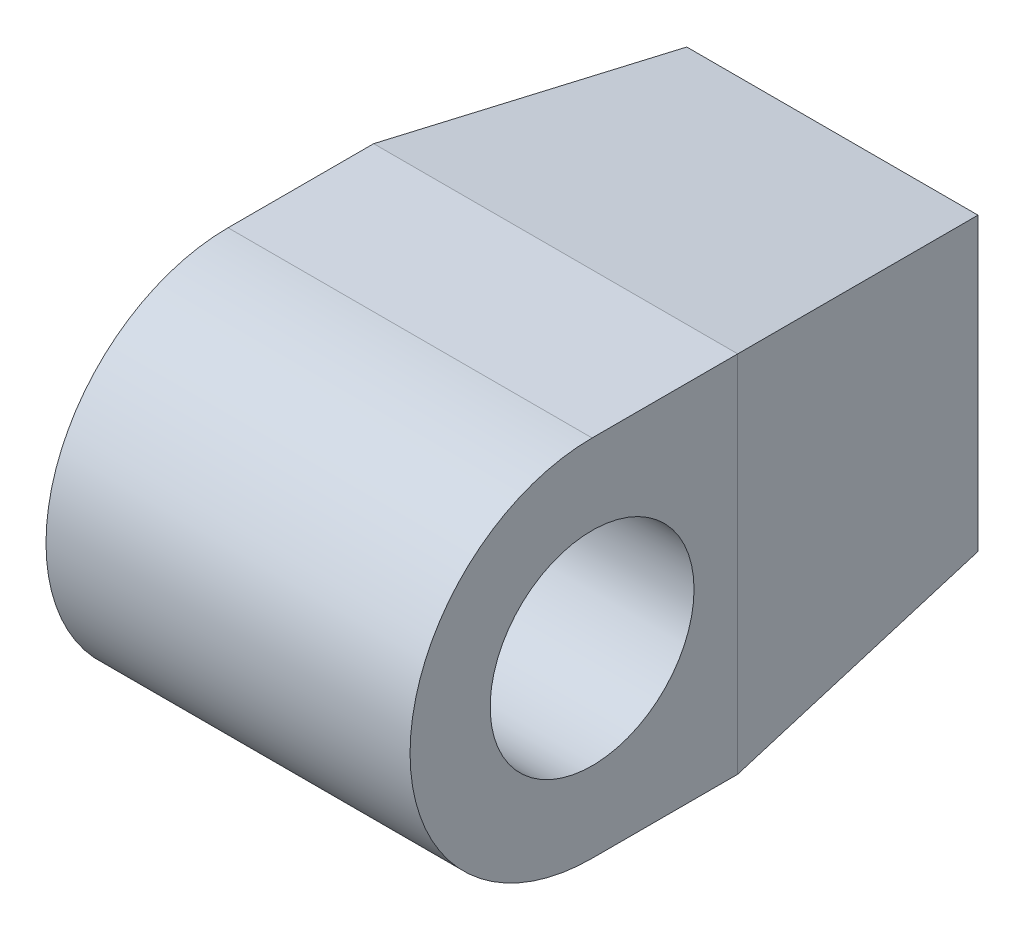
ISO-10303-21;
HEADER;
FILE_DESCRIPTION(('STEP AP214'),'2;1');
FILE_NAME('part.step','',(''),(''),'','','');
FILE_SCHEMA(('AUTOMOTIVE_DESIGN { 1 0 10303 214 1 1 1 1 }'));
ENDSEC;
DATA;
#1=APPLICATION_CONTEXT('core data for automotive mechanical design processes');
#2=APPLICATION_PROTOCOL_DEFINITION('international standard','automotive_design',2000,#1);
#3=PRODUCT_CONTEXT('',#1,'mechanical');
#4=PRODUCT('Part','Part','',(#3));
#5=PRODUCT_RELATED_PRODUCT_CATEGORY('part','',(#4));
#6=PRODUCT_DEFINITION_FORMATION('','',#4);
#7=PRODUCT_DEFINITION_CONTEXT('part definition',#1,'design');
#8=PRODUCT_DEFINITION('design','',#6,#7);
#9=PRODUCT_DEFINITION_SHAPE('','',#8);
#10=(LENGTH_UNIT() NAMED_UNIT(*) SI_UNIT(.MILLI.,.METRE.));
#11=(NAMED_UNIT(*) PLANE_ANGLE_UNIT() SI_UNIT($,.RADIAN.));
#12=(NAMED_UNIT(*) SI_UNIT($,.STERADIAN.) SOLID_ANGLE_UNIT());
#13=UNCERTAINTY_MEASURE_WITH_UNIT(LENGTH_MEASURE(1.E-05),#10,'distance_accuracy_value','');
#14=(GEOMETRIC_REPRESENTATION_CONTEXT(3) GLOBAL_UNCERTAINTY_ASSIGNED_CONTEXT((#13)) GLOBAL_UNIT_ASSIGNED_CONTEXT((#10,
#11,#12)) REPRESENTATION_CONTEXT('',''));
#15=CARTESIAN_POINT('',(0.,0.,0.));
#16=DIRECTION('',(0.,0.,1.));
#17=DIRECTION('',(1.,0.,0.));
#18=AXIS2_PLACEMENT_3D('',#15,#16,#17);
#19=CARTESIAN_POINT('',(0.,0.,0.));
#20=DIRECTION('',(0.,0.,-1.));
#21=DIRECTION('',(-1.,0.,0.));
#22=AXIS2_PLACEMENT_3D('',#19,#20,#21);
#23=PLANE('',#22);
#24=CARTESIAN_POINT('',(0.,0.,0.));
#25=DIRECTION('',(0.,0.,-1.));
#26=DIRECTION('',(-1.,0.,0.));
#27=AXIS2_PLACEMENT_3D('',#24,#25,#26);
#28=CIRCLE('',#27,4.025);
#29=CARTESIAN_POINT('',(-4.025,0.,0.));
#30=VERTEX_POINT('',#29);
#31=EDGE_CURVE('E127',#30,#30,#28,.T.);
#32=ORIENTED_EDGE('',*,*,#31,.F.);
#33=EDGE_LOOP('',(#32));
#34=FACE_BOUND('',#33,.T.);
#35=DIRECTION('',(0.,1.,0.));
#36=VECTOR('',#35,1.);
#37=CARTESIAN_POINT('',(10.,-10.,0.));
#38=LINE('',#37,#36);
#39=CARTESIAN_POINT('',(10.,-10.,0.));
#40=VERTEX_POINT('',#39);
#41=CARTESIAN_POINT('',(10.,10.,0.));
#42=VERTEX_POINT('',#41);
#43=EDGE_CURVE('E256',#40,#42,#38,.T.);
#44=ORIENTED_EDGE('',*,*,#43,.F.);
#45=DIRECTION('',(1.,0.,0.));
#46=VECTOR('',#45,1.);
#47=CARTESIAN_POINT('',(-10.,-10.,0.));
#48=LINE('',#47,#46);
#49=CARTESIAN_POINT('',(-10.,-10.,0.));
#50=VERTEX_POINT('',#49);
#51=EDGE_CURVE('E12',#50,#40,#48,.T.);
#52=ORIENTED_EDGE('',*,*,#51,.F.);
#53=DIRECTION('',(0.,-1.,0.));
#54=VECTOR('',#53,1.);
#55=CARTESIAN_POINT('',(-10.,-10.,0.));
#56=LINE('',#55,#54);
#57=CARTESIAN_POINT('',(-10.,10.,0.));
#58=VERTEX_POINT('',#57);
#59=EDGE_CURVE('E60',#58,#50,#56,.T.);
#60=ORIENTED_EDGE('',*,*,#59,.F.);
#61=DIRECTION('',(-1.,0.,0.));
#62=VECTOR('',#61,1.);
#63=CARTESIAN_POINT('',(-10.,10.,0.));
#64=LINE('',#63,#62);
#65=EDGE_CURVE('E262',#42,#58,#64,.T.);
#66=ORIENTED_EDGE('',*,*,#65,.F.);
#67=EDGE_LOOP('',(#44,#52,#60,#66));
#68=FACE_BOUND('',#67,.T.);
#69=ADVANCED_FACE('F49',(#34,#68),#23,.T.);
#70=CARTESIAN_POINT('',(0.,9.82981620149762,-1.29339686861811));
#71=DIRECTION('',(0.,0.991454295542544,-0.130454512571387));
#72=DIRECTION('',(0.,0.130454512571387,0.991454295542544));
#73=AXIS2_PLACEMENT_3D('',#70,#71,#72);
#74=PLANE('',#73);
#75=DIRECTION('',(-0.129358420951055,-0.129358420951055,-0.983123999228022));
#76=VECTOR('',#75,1.);
#77=CARTESIAN_POINT('',(12.5,12.5,19.));
#78=LINE('',#77,#76);
#79=CARTESIAN_POINT('',(12.50005,12.5,19.));
#80=VERTEX_POINT('',#79);
#81=EDGE_CURVE('E197',#80,#42,#78,.T.);
#82=ORIENTED_EDGE('',*,*,#81,.T.);
#83=ORIENTED_EDGE('',*,*,#65,.T.);
#84=DIRECTION('',(0.129358420951055,-0.129358420951055,-0.983123999228022));
#85=VECTOR('',#84,1.);
#86=CARTESIAN_POINT('',(-12.5,12.5,19.));
#87=LINE('',#86,#85);
#88=CARTESIAN_POINT('',(-12.50005,12.5,19.));
#89=VERTEX_POINT('',#88);
#90=EDGE_CURVE('E267',#89,#58,#87,.T.);
#91=ORIENTED_EDGE('',*,*,#90,.F.);
#92=DIRECTION('',(-1.,0.,0.));
#93=VECTOR('',#92,1.);
#94=CARTESIAN_POINT('',(-12.5,12.5,19.));
#95=LINE('',#94,#93);
#96=EDGE_CURVE('E214',#80,#89,#95,.T.);
#97=ORIENTED_EDGE('',*,*,#96,.F.);
#98=EDGE_LOOP('',(#82,#83,#91,#97));
#99=FACE_BOUND('',#98,.T.);
#100=ADVANCED_FACE('F231',(#99),#74,.T.);
#101=CARTESIAN_POINT('',(-9.82981620149762,0.,-1.29339686861811));
#102=DIRECTION('',(-0.991454295542544,0.,-0.130454512571387));
#103=DIRECTION('',(-0.130454512571387,0.,0.991454295542544));
#104=AXIS2_PLACEMENT_3D('',#101,#102,#103);
#105=PLANE('',#104);
#106=ORIENTED_EDGE('',*,*,#90,.T.);
#107=ORIENTED_EDGE('',*,*,#59,.T.);
#108=DIRECTION('',(0.129358420951055,0.129358420951055,-0.983123999228022));
#109=VECTOR('',#108,1.);
#110=CARTESIAN_POINT('',(-12.5,-12.5,19.));
#111=LINE('',#110,#109);
#112=CARTESIAN_POINT('',(-12.50005,-12.5,19.));
#113=VERTEX_POINT('',#112);
#114=EDGE_CURVE('E263',#113,#50,#111,.T.);
#115=ORIENTED_EDGE('',*,*,#114,.F.);
#116=DIRECTION('',(0.,-1.,0.));
#117=VECTOR('',#116,1.);
#118=CARTESIAN_POINT('',(-12.5,-12.5,19.));
#119=LINE('',#118,#117);
#120=EDGE_CURVE('E198',#89,#113,#119,.T.);
#121=ORIENTED_EDGE('',*,*,#120,.F.);
#122=EDGE_LOOP('',(#106,#107,#115,#121));
#123=FACE_BOUND('',#122,.T.);
#124=ADVANCED_FACE('F235',(#123),#105,.T.);
#125=CARTESIAN_POINT('',(9.82981620149762,0.,-1.29339686861811));
#126=DIRECTION('',(0.991454295542544,0.,-0.130454512571387));
#127=DIRECTION('',(-0.130454512571387,0.,-0.991454295542544));
#128=AXIS2_PLACEMENT_3D('',#125,#126,#127);
#129=PLANE('',#128);
#130=DIRECTION('',(-0.129358420951055,0.129358420951055,-0.983123999228022));
#131=VECTOR('',#130,1.);
#132=CARTESIAN_POINT('',(12.5,-12.5,19.));
#133=LINE('',#132,#131);
#134=CARTESIAN_POINT('',(12.50005,-12.5,19.));
#135=VERTEX_POINT('',#134);
#136=EDGE_CURVE('E68',#135,#40,#133,.T.);
#137=ORIENTED_EDGE('',*,*,#136,.T.);
#138=ORIENTED_EDGE('',*,*,#43,.T.);
#139=ORIENTED_EDGE('',*,*,#81,.F.);
#140=DIRECTION('',(0.,1.,0.));
#141=VECTOR('',#140,1.);
#142=CARTESIAN_POINT('',(12.5,-12.5,19.));
#143=LINE('',#142,#141);
#144=EDGE_CURVE('E53',#135,#80,#143,.T.);
#145=ORIENTED_EDGE('',*,*,#144,.F.);
#146=EDGE_LOOP('',(#137,#138,#139,#145));
#147=FACE_BOUND('',#146,.T.);
#148=ADVANCED_FACE('F258',(#147),#129,.T.);
#149=CARTESIAN_POINT('',(0.,-9.82981620149762,-1.29339686861811));
#150=DIRECTION('',(0.,-0.991454295542544,-0.130454512571387));
#151=DIRECTION('',(0.,0.130454512571387,-0.991454295542544));
#152=AXIS2_PLACEMENT_3D('',#149,#150,#151);
#153=PLANE('',#152);
#154=ORIENTED_EDGE('',*,*,#114,.T.);
#155=ORIENTED_EDGE('',*,*,#51,.T.);
#156=ORIENTED_EDGE('',*,*,#136,.F.);
#157=DIRECTION('',(1.,0.,0.));
#158=VECTOR('',#157,1.);
#159=CARTESIAN_POINT('',(-12.5,-12.5,19.));
#160=LINE('',#159,#158);
#161=EDGE_CURVE('E188',#113,#135,#160,.T.);
#162=ORIENTED_EDGE('',*,*,#161,.F.);
#163=EDGE_LOOP('',(#154,#155,#156,#162));
#164=FACE_BOUND('',#163,.T.);
#165=ADVANCED_FACE('F229',(#164),#153,.T.);
#166=CARTESIAN_POINT('',(12.5001,12.5,19.));
#167=DIRECTION('',(0.,-1.,0.));
#168=DIRECTION('',(0.,0.,-1.));
#169=AXIS2_PLACEMENT_3D('',#166,#167,#168);
#170=PLANE('',#169);
#171=ORIENTED_EDGE('',*,*,#96,.T.);
#172=DIRECTION('',(0.,0.,1.));
#173=VECTOR('',#172,1.);
#174=CARTESIAN_POINT('',(-12.5001,12.5,19.));
#175=LINE('',#174,#173);
#176=CARTESIAN_POINT('',(-12.5001,12.5,29.));
#177=VERTEX_POINT('',#176);
#178=EDGE_CURVE('E133',#89,#177,#175,.T.);
#179=ORIENTED_EDGE('',*,*,#178,.T.);
#180=DIRECTION('',(-1.,0.,0.));
#181=VECTOR('',#180,1.);
#182=CARTESIAN_POINT('',(12.5001,12.5,29.));
#183=LINE('',#182,#181);
#184=CARTESIAN_POINT('',(12.5001,12.5,29.));
#185=VERTEX_POINT('',#184);
#186=EDGE_CURVE('E148',#185,#177,#183,.T.);
#187=ORIENTED_EDGE('',*,*,#186,.F.);
#188=DIRECTION('',(0.,0.,1.));
#189=VECTOR('',#188,1.);
#190=CARTESIAN_POINT('',(12.5001,12.5,19.));
#191=LINE('',#190,#189);
#192=EDGE_CURVE('E144',#80,#185,#191,.T.);
#193=ORIENTED_EDGE('',*,*,#192,.F.);
#194=EDGE_LOOP('',(#171,#179,#187,#193));
#195=FACE_BOUND('',#194,.T.);
#196=ADVANCED_FACE('F220',(#195),#170,.F.);
#197=CARTESIAN_POINT('',(12.5001,0.,29.));
#198=DIRECTION('',(-1.,0.,0.));
#199=DIRECTION('',(0.,0.,1.));
#200=AXIS2_PLACEMENT_3D('',#197,#198,#199);
#201=CYLINDRICAL_SURFACE('',#200,12.5);
#202=ORIENTED_EDGE('',*,*,#186,.T.);
#203=CARTESIAN_POINT('',(-12.5001,0.,29.));
#204=DIRECTION('',(1.,0.,0.));
#205=DIRECTION('',(0.,0.,-1.));
#206=AXIS2_PLACEMENT_3D('',#203,#204,#205);
#207=CIRCLE('',#206,12.5);
#208=CARTESIAN_POINT('',(-12.5001,-12.5,29.));
#209=VERTEX_POINT('',#208);
#210=EDGE_CURVE('E135',#177,#209,#207,.T.);
#211=ORIENTED_EDGE('',*,*,#210,.T.);
#212=DIRECTION('',(-1.,0.,0.));
#213=VECTOR('',#212,1.);
#214=CARTESIAN_POINT('',(12.5001,-12.5,29.));
#215=LINE('',#214,#213);
#216=CARTESIAN_POINT('',(12.5001,-12.5,29.));
#217=VERTEX_POINT('',#216);
#218=EDGE_CURVE('E145',#217,#209,#215,.T.);
#219=ORIENTED_EDGE('',*,*,#218,.F.);
#220=CARTESIAN_POINT('',(12.5001,0.,29.));
#221=DIRECTION('',(1.,0.,0.));
#222=DIRECTION('',(0.,0.,-1.));
#223=AXIS2_PLACEMENT_3D('',#220,#221,#222);
#224=CIRCLE('',#223,12.5);
#225=EDGE_CURVE('E140',#185,#217,#224,.T.);
#226=ORIENTED_EDGE('',*,*,#225,.F.);
#227=EDGE_LOOP('',(#202,#211,#219,#226));
#228=FACE_BOUND('',#227,.T.);
#229=ADVANCED_FACE('F178',(#228),#201,.T.);
#230=CARTESIAN_POINT('',(12.5001,-12.5,29.));
#231=DIRECTION('',(0.,1.,0.));
#232=DIRECTION('',(0.,0.,1.));
#233=AXIS2_PLACEMENT_3D('',#230,#231,#232);
#234=PLANE('',#233);
#235=ORIENTED_EDGE('',*,*,#218,.T.);
#236=DIRECTION('',(0.,0.,-1.));
#237=VECTOR('',#236,1.);
#238=CARTESIAN_POINT('',(-12.5001,-12.5,29.));
#239=LINE('',#238,#237);
#240=EDGE_CURVE('E139',#209,#113,#239,.T.);
#241=ORIENTED_EDGE('',*,*,#240,.T.);
#242=ORIENTED_EDGE('',*,*,#161,.T.);
#243=DIRECTION('',(0.,0.,-1.));
#244=VECTOR('',#243,1.);
#245=CARTESIAN_POINT('',(12.5001,-12.5,29.));
#246=LINE('',#245,#244);
#247=EDGE_CURVE('E143',#217,#135,#246,.T.);
#248=ORIENTED_EDGE('',*,*,#247,.F.);
#249=EDGE_LOOP('',(#235,#241,#242,#248));
#250=FACE_BOUND('',#249,.T.);
#251=ADVANCED_FACE('F171',(#250),#234,.F.);
#252=CARTESIAN_POINT('',(12.5001,0.,29.));
#253=DIRECTION('',(1.,0.,0.));
#254=DIRECTION('',(0.,0.,-1.));
#255=AXIS2_PLACEMENT_3D('',#252,#253,#254);
#256=PLANE('',#255);
#257=CARTESIAN_POINT('',(12.5001,0.,29.));
#258=DIRECTION('',(1.,0.,0.));
#259=DIRECTION('',(0.,0.,-1.));
#260=AXIS2_PLACEMENT_3D('',#257,#258,#259);
#261=CIRCLE('',#260,7.);
#262=CARTESIAN_POINT('',(12.5001,0.,22.));
#263=VERTEX_POINT('',#262);
#264=EDGE_CURVE('E118',#263,#263,#261,.T.);
#265=ORIENTED_EDGE('',*,*,#264,.F.);
#266=EDGE_LOOP('',(#265));
#267=FACE_BOUND('',#266,.T.);
#268=ORIENTED_EDGE('',*,*,#144,.T.);
#269=ORIENTED_EDGE('',*,*,#192,.T.);
#270=ORIENTED_EDGE('',*,*,#225,.T.);
#271=ORIENTED_EDGE('',*,*,#247,.T.);
#272=EDGE_LOOP('',(#268,#269,#270,#271));
#273=FACE_BOUND('',#272,.T.);
#274=ADVANCED_FACE('F160',(#267,#273),#256,.T.);
#275=CARTESIAN_POINT('',(-12.5001,0.,29.));
#276=DIRECTION('',(1.,0.,0.));
#277=DIRECTION('',(0.,0.,-1.));
#278=AXIS2_PLACEMENT_3D('',#275,#276,#277);
#279=PLANE('',#278);
#280=ORIENTED_EDGE('',*,*,#120,.T.);
#281=ORIENTED_EDGE('',*,*,#240,.F.);
#282=ORIENTED_EDGE('',*,*,#210,.F.);
#283=ORIENTED_EDGE('',*,*,#178,.F.);
#284=EDGE_LOOP('',(#280,#281,#282,#283));
#285=FACE_BOUND('',#284,.T.);
#286=ADVANCED_FACE('F170',(#285),#279,.F.);
#287=CARTESIAN_POINT('',(2.5001,0.,29.));
#288=DIRECTION('',(1.,0.,0.));
#289=DIRECTION('',(0.,0.,-1.));
#290=AXIS2_PLACEMENT_3D('',#287,#288,#289);
#291=CYLINDRICAL_SURFACE('',#290,7.);
#292=CARTESIAN_POINT('',(2.5001,0.,29.));
#293=DIRECTION('',(1.,0.,0.));
#294=DIRECTION('',(0.,0.,-1.));
#295=AXIS2_PLACEMENT_3D('',#292,#293,#294);
#296=CIRCLE('',#295,7.);
#297=CARTESIAN_POINT('',(2.5001,0.,22.));
#298=VERTEX_POINT('',#297);
#299=EDGE_CURVE('E124',#298,#298,#296,.T.);
#300=ORIENTED_EDGE('',*,*,#299,.F.);
#301=EDGE_LOOP('',(#300));
#302=FACE_BOUND('',#301,.T.);
#303=ORIENTED_EDGE('',*,*,#264,.T.);
#304=EDGE_LOOP('',(#303));
#305=FACE_BOUND('',#304,.T.);
#306=ADVANCED_FACE('F393',(#302,#305),#291,.F.);
#307=CARTESIAN_POINT('',(2.5001,0.,29.));
#308=DIRECTION('',(1.,0.,0.));
#309=DIRECTION('',(0.,0.,-1.));
#310=AXIS2_PLACEMENT_3D('',#307,#308,#309);
#311=PLANE('',#310);
#312=ORIENTED_EDGE('',*,*,#299,.T.);
#313=EDGE_LOOP('',(#312));
#314=FACE_BOUND('',#313,.T.);
#315=ADVANCED_FACE('F111',(#314),#311,.T.);
#316=CARTESIAN_POINT('',(0.,0.,12.));
#317=DIRECTION('',(0.,0.,-1.));
#318=DIRECTION('',(-1.,0.,0.));
#319=AXIS2_PLACEMENT_3D('',#316,#317,#318);
#320=CONICAL_SURFACE('',#319,3.99999999999999,1.02974425867666);
#321=CARTESIAN_POINT('',(0.,0.,14.4034424761102));
#322=VERTEX_POINT('',#321);
#323=VERTEX_LOOP('',#322);
#324=FACE_BOUND('',#323,.T.);
#325=CARTESIAN_POINT('',(0.,0.,12.));
#326=DIRECTION('',(0.,0.,-1.));
#327=DIRECTION('',(-1.,0.,0.));
#328=AXIS2_PLACEMENT_3D('',#325,#326,#327);
#329=CIRCLE('',#328,3.99999999999999);
#330=CARTESIAN_POINT('',(-3.99999999999999,0.,12.));
#331=VERTEX_POINT('',#330);
#332=EDGE_CURVE('E115',#331,#331,#329,.T.);
#333=ORIENTED_EDGE('',*,*,#332,.T.);
#334=EDGE_LOOP('',(#333));
#335=FACE_BOUND('',#334,.T.);
#336=ADVANCED_FACE('F107',(#324,#335),#320,.F.);
#337=CARTESIAN_POINT('',(0.,0.,0.));
#338=DIRECTION('',(0.,0.,-1.));
#339=DIRECTION('',(-1.,0.,0.));
#340=AXIS2_PLACEMENT_3D('',#337,#338,#339);
#341=CYLINDRICAL_SURFACE('',#340,3.99999999999999);
#342=ORIENTED_EDGE('',*,*,#332,.F.);
#343=EDGE_LOOP('',(#342));
#344=FACE_BOUND('',#343,.T.);
#345=CARTESIAN_POINT('',(0.,0.,0.0250000000000025));
#346=DIRECTION('',(0.,0.,-1.));
#347=DIRECTION('',(-1.,0.,0.));
#348=AXIS2_PLACEMENT_3D('',#345,#346,#347);
#349=CIRCLE('',#348,4.);
#350=CARTESIAN_POINT('',(-4.,0.,0.0250000000000025));
#351=VERTEX_POINT('',#350);
#352=EDGE_CURVE('E119',#351,#351,#349,.T.);
#353=ORIENTED_EDGE('',*,*,#352,.T.);
#354=EDGE_LOOP('',(#353));
#355=FACE_BOUND('',#354,.T.);
#356=ADVANCED_FACE('F110',(#344,#355),#341,.F.);
#357=CARTESIAN_POINT('',(0.,0.,0.));
#358=DIRECTION('',(0.,0.,-1.));
#359=DIRECTION('',(-1.,0.,0.));
#360=AXIS2_PLACEMENT_3D('',#357,#358,#359);
#361=CONICAL_SURFACE('',#360,4.025,0.785398163397396);
#362=ORIENTED_EDGE('',*,*,#352,.F.);
#363=EDGE_LOOP('',(#362));
#364=FACE_BOUND('',#363,.T.);
#365=ORIENTED_EDGE('',*,*,#31,.T.);
#366=EDGE_LOOP('',(#365));
#367=FACE_BOUND('',#366,.T.);
#368=ADVANCED_FACE('F382',(#364,#367),#361,.F.);
#369=CLOSED_SHELL('',(#69,#100,#124,#148,#165,#196,#229,#251,#274,#286,#306,#315,#336,#356,#368));
#370=MANIFOLD_SOLID_BREP('B2',#369);
#371=ADVANCED_BREP_SHAPE_REPRESENTATION('',(#18,#370),#14);
#372=SHAPE_DEFINITION_REPRESENTATION(#9,#371);
ENDSEC;
END-ISO-10303-21;
